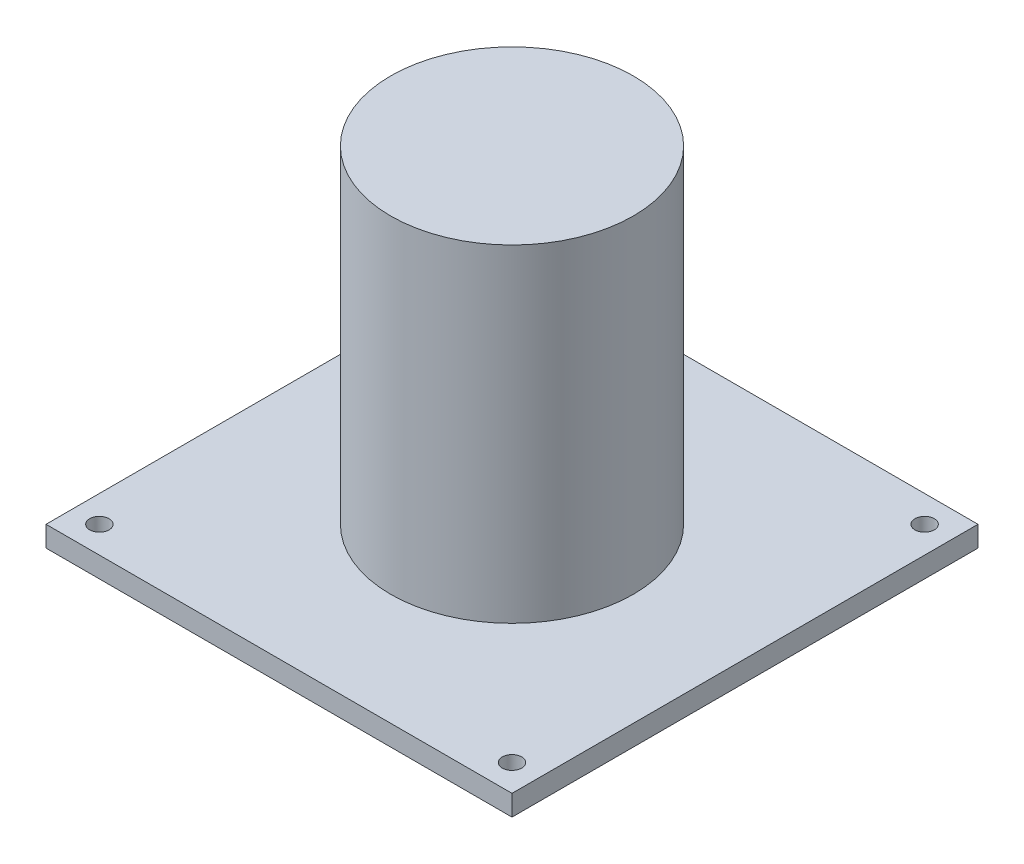
ISO-10303-21;
HEADER;
FILE_DESCRIPTION(('STEP AP214'),'2;1');
FILE_NAME('part.step','',(''),(''),'','','');
FILE_SCHEMA(('AUTOMOTIVE_DESIGN { 1 0 10303 214 1 1 1 1 }'));
ENDSEC;
DATA;
#1=APPLICATION_CONTEXT('core data for automotive mechanical design processes');
#2=APPLICATION_PROTOCOL_DEFINITION('international standard','automotive_design',2000,#1);
#3=PRODUCT_CONTEXT('',#1,'mechanical');
#4=PRODUCT('Part','Part','',(#3));
#5=PRODUCT_RELATED_PRODUCT_CATEGORY('part','',(#4));
#6=PRODUCT_DEFINITION_FORMATION('','',#4);
#7=PRODUCT_DEFINITION_CONTEXT('part definition',#1,'design');
#8=PRODUCT_DEFINITION('design','',#6,#7);
#9=PRODUCT_DEFINITION_SHAPE('','',#8);
#10=(LENGTH_UNIT() NAMED_UNIT(*) SI_UNIT(.MILLI.,.METRE.));
#11=(NAMED_UNIT(*) PLANE_ANGLE_UNIT() SI_UNIT($,.RADIAN.));
#12=(NAMED_UNIT(*) SI_UNIT($,.STERADIAN.) SOLID_ANGLE_UNIT());
#13=UNCERTAINTY_MEASURE_WITH_UNIT(LENGTH_MEASURE(1.E-05),#10,'distance_accuracy_value','');
#14=(GEOMETRIC_REPRESENTATION_CONTEXT(3) GLOBAL_UNCERTAINTY_ASSIGNED_CONTEXT((#13)) GLOBAL_UNIT_ASSIGNED_CONTEXT((#10,
#11,#12)) REPRESENTATION_CONTEXT('',''));
#15=CARTESIAN_POINT('',(0.,0.,0.));
#16=DIRECTION('',(0.,0.,1.));
#17=DIRECTION('',(1.,0.,0.));
#18=AXIS2_PLACEMENT_3D('',#15,#16,#17);
#19=CARTESIAN_POINT('',(19.2,1.7,19.2));
#20=DIRECTION('',(-1.,0.,0.));
#21=DIRECTION('',(0.,0.,1.));
#22=AXIS2_PLACEMENT_3D('',#19,#20,#21);
#23=PLANE('',#22);
#24=DIRECTION('',(0.,0.,-1.));
#25=VECTOR('',#24,1.);
#26=CARTESIAN_POINT('',(19.2,0.,19.2));
#27=LINE('',#26,#25);
#28=CARTESIAN_POINT('',(19.2,0.,19.2));
#29=VERTEX_POINT('',#28);
#30=CARTESIAN_POINT('',(19.2,0.,-19.2));
#31=VERTEX_POINT('',#30);
#32=EDGE_CURVE('E111',#29,#31,#27,.T.);
#33=ORIENTED_EDGE('',*,*,#32,.T.);
#34=DIRECTION('',(0.,-1.,0.));
#35=VECTOR('',#34,1.);
#36=CARTESIAN_POINT('',(19.2,1.7,-19.2));
#37=LINE('',#36,#35);
#38=CARTESIAN_POINT('',(19.2,1.7,-19.2));
#39=VERTEX_POINT('',#38);
#40=EDGE_CURVE('E43',#39,#31,#37,.T.);
#41=ORIENTED_EDGE('',*,*,#40,.F.);
#42=DIRECTION('',(0.,0.,-1.));
#43=VECTOR('',#42,1.);
#44=CARTESIAN_POINT('',(19.2,1.7,19.2));
#45=LINE('',#44,#43);
#46=CARTESIAN_POINT('',(19.2,1.7,19.2));
#47=VERTEX_POINT('',#46);
#48=EDGE_CURVE('E94',#47,#39,#45,.T.);
#49=ORIENTED_EDGE('',*,*,#48,.F.);
#50=DIRECTION('',(0.,-1.,0.));
#51=VECTOR('',#50,1.);
#52=CARTESIAN_POINT('',(19.2,1.7,19.2));
#53=LINE('',#52,#51);
#54=EDGE_CURVE('E107',#47,#29,#53,.T.);
#55=ORIENTED_EDGE('',*,*,#54,.T.);
#56=EDGE_LOOP('',(#33,#41,#49,#55));
#57=FACE_BOUND('',#56,.T.);
#58=ADVANCED_FACE('F40',(#57),#23,.F.);
#59=CARTESIAN_POINT('',(-19.2,1.7,-19.2));
#60=DIRECTION('',(0.,0.,1.));
#61=DIRECTION('',(1.,0.,0.));
#62=AXIS2_PLACEMENT_3D('',#59,#60,#61);
#63=PLANE('',#62);
#64=DIRECTION('',(-1.,0.,0.));
#65=VECTOR('',#64,1.);
#66=CARTESIAN_POINT('',(-19.2,0.,-19.2));
#67=LINE('',#66,#65);
#68=CARTESIAN_POINT('',(-19.2,0.,-19.2));
#69=VERTEX_POINT('',#68);
#70=EDGE_CURVE('E100',#31,#69,#67,.T.);
#71=ORIENTED_EDGE('',*,*,#70,.T.);
#72=DIRECTION('',(0.,-1.,0.));
#73=VECTOR('',#72,1.);
#74=CARTESIAN_POINT('',(-19.2,1.7,-19.2));
#75=LINE('',#74,#73);
#76=CARTESIAN_POINT('',(-19.2,1.7,-19.2));
#77=VERTEX_POINT('',#76);
#78=EDGE_CURVE('E98',#77,#69,#75,.T.);
#79=ORIENTED_EDGE('',*,*,#78,.F.);
#80=DIRECTION('',(-1.,0.,0.));
#81=VECTOR('',#80,1.);
#82=CARTESIAN_POINT('',(-19.2,1.7,-19.2));
#83=LINE('',#82,#81);
#84=EDGE_CURVE('E89',#39,#77,#83,.T.);
#85=ORIENTED_EDGE('',*,*,#84,.F.);
#86=ORIENTED_EDGE('',*,*,#40,.T.);
#87=EDGE_LOOP('',(#71,#79,#85,#86));
#88=FACE_BOUND('',#87,.T.);
#89=ADVANCED_FACE('F99',(#88),#63,.F.);
#90=CARTESIAN_POINT('',(-19.2,1.7,19.2));
#91=DIRECTION('',(1.,0.,0.));
#92=DIRECTION('',(0.,0.,-1.));
#93=AXIS2_PLACEMENT_3D('',#90,#91,#92);
#94=PLANE('',#93);
#95=DIRECTION('',(0.,0.,1.));
#96=VECTOR('',#95,1.);
#97=CARTESIAN_POINT('',(-19.2,0.,19.2));
#98=LINE('',#97,#96);
#99=CARTESIAN_POINT('',(-19.2,0.,19.2));
#100=VERTEX_POINT('',#99);
#101=EDGE_CURVE('E75',#69,#100,#98,.T.);
#102=ORIENTED_EDGE('',*,*,#101,.T.);
#103=DIRECTION('',(0.,-1.,0.));
#104=VECTOR('',#103,1.);
#105=CARTESIAN_POINT('',(-19.2,1.7,19.2));
#106=LINE('',#105,#104);
#107=CARTESIAN_POINT('',(-19.2,1.7,19.2));
#108=VERTEX_POINT('',#107);
#109=EDGE_CURVE('E102',#108,#100,#106,.T.);
#110=ORIENTED_EDGE('',*,*,#109,.F.);
#111=DIRECTION('',(0.,0.,1.));
#112=VECTOR('',#111,1.);
#113=CARTESIAN_POINT('',(-19.2,1.7,19.2));
#114=LINE('',#113,#112);
#115=EDGE_CURVE('E92',#77,#108,#114,.T.);
#116=ORIENTED_EDGE('',*,*,#115,.F.);
#117=ORIENTED_EDGE('',*,*,#78,.T.);
#118=EDGE_LOOP('',(#102,#110,#116,#117));
#119=FACE_BOUND('',#118,.T.);
#120=ADVANCED_FACE('F103',(#119),#94,.F.);
#121=CARTESIAN_POINT('',(-19.2,1.7,19.2));
#122=DIRECTION('',(0.,0.,-1.));
#123=DIRECTION('',(-1.,0.,0.));
#124=AXIS2_PLACEMENT_3D('',#121,#122,#123);
#125=PLANE('',#124);
#126=DIRECTION('',(1.,0.,0.));
#127=VECTOR('',#126,1.);
#128=CARTESIAN_POINT('',(-19.2,0.,19.2));
#129=LINE('',#128,#127);
#130=EDGE_CURVE('E81',#100,#29,#129,.T.);
#131=ORIENTED_EDGE('',*,*,#130,.T.);
#132=ORIENTED_EDGE('',*,*,#54,.F.);
#133=DIRECTION('',(1.,0.,0.));
#134=VECTOR('',#133,1.);
#135=CARTESIAN_POINT('',(-19.2,1.7,19.2));
#136=LINE('',#135,#134);
#137=EDGE_CURVE('E58',#108,#47,#136,.T.);
#138=ORIENTED_EDGE('',*,*,#137,.F.);
#139=ORIENTED_EDGE('',*,*,#109,.T.);
#140=EDGE_LOOP('',(#131,#132,#138,#139));
#141=FACE_BOUND('',#140,.T.);
#142=ADVANCED_FACE('F125',(#141),#125,.F.);
#143=CARTESIAN_POINT('',(0.,1.7,0.));
#144=DIRECTION('',(0.,-1.,0.));
#145=DIRECTION('',(0.,0.,-1.));
#146=AXIS2_PLACEMENT_3D('',#143,#144,#145);
#147=PLANE('',#146);
#148=CARTESIAN_POINT('',(-17.,1.7,-17.));
#149=DIRECTION('',(0.,-1.,0.));
#150=DIRECTION('',(0.,0.,-1.));
#151=AXIS2_PLACEMENT_3D('',#148,#149,#150);
#152=CIRCLE('',#151,0.799999999999999);
#153=CARTESIAN_POINT('',(-17.,1.7,-17.8));
#154=VERTEX_POINT('',#153);
#155=EDGE_CURVE('E135',#154,#154,#152,.T.);
#156=ORIENTED_EDGE('',*,*,#155,.T.);
#157=EDGE_LOOP('',(#156));
#158=FACE_BOUND('',#157,.T.);
#159=CARTESIAN_POINT('',(17.,1.7,-17.));
#160=DIRECTION('',(0.,-1.,0.));
#161=DIRECTION('',(0.,0.,-1.));
#162=AXIS2_PLACEMENT_3D('',#159,#160,#161);
#163=CIRCLE('',#162,0.799999999999999);
#164=CARTESIAN_POINT('',(17.,1.7,-17.8));
#165=VERTEX_POINT('',#164);
#166=EDGE_CURVE('E139',#165,#165,#163,.T.);
#167=ORIENTED_EDGE('',*,*,#166,.T.);
#168=EDGE_LOOP('',(#167));
#169=FACE_BOUND('',#168,.T.);
#170=CARTESIAN_POINT('',(17.,1.7,17.));
#171=DIRECTION('',(0.,-1.,0.));
#172=DIRECTION('',(0.,0.,-1.));
#173=AXIS2_PLACEMENT_3D('',#170,#171,#172);
#174=CIRCLE('',#173,0.799999999999999);
#175=CARTESIAN_POINT('',(17.,1.7,16.2));
#176=VERTEX_POINT('',#175);
#177=EDGE_CURVE('E143',#176,#176,#174,.T.);
#178=ORIENTED_EDGE('',*,*,#177,.T.);
#179=EDGE_LOOP('',(#178));
#180=FACE_BOUND('',#179,.T.);
#181=CARTESIAN_POINT('',(-17.,1.7,17.));
#182=DIRECTION('',(0.,-1.,0.));
#183=DIRECTION('',(0.,0.,-1.));
#184=AXIS2_PLACEMENT_3D('',#181,#182,#183);
#185=CIRCLE('',#184,0.799999999999999);
#186=CARTESIAN_POINT('',(-17.,1.7,16.2));
#187=VERTEX_POINT('',#186);
#188=EDGE_CURVE('E147',#187,#187,#185,.T.);
#189=ORIENTED_EDGE('',*,*,#188,.T.);
#190=EDGE_LOOP('',(#189));
#191=FACE_BOUND('',#190,.T.);
#192=CARTESIAN_POINT('',(0.,1.7,0.));
#193=DIRECTION('',(0.,1.,0.));
#194=DIRECTION('',(0.,0.,1.));
#195=AXIS2_PLACEMENT_3D('',#192,#193,#194);
#196=CIRCLE('',#195,10.);
#197=CARTESIAN_POINT('',(0.,1.7,10.));
#198=VERTEX_POINT('',#197);
#199=EDGE_CURVE('E11',#198,#198,#196,.T.);
#200=ORIENTED_EDGE('',*,*,#199,.F.);
#201=EDGE_LOOP('',(#200));
#202=FACE_BOUND('',#201,.T.);
#203=ORIENTED_EDGE('',*,*,#48,.T.);
#204=ORIENTED_EDGE('',*,*,#84,.T.);
#205=ORIENTED_EDGE('',*,*,#115,.T.);
#206=ORIENTED_EDGE('',*,*,#137,.T.);
#207=EDGE_LOOP('',(#203,#204,#205,#206));
#208=FACE_BOUND('',#207,.T.);
#209=ADVANCED_FACE('F90',(#158,#169,#180,#191,#202,#208),#147,.F.);
#210=CARTESIAN_POINT('',(0.,0.,0.));
#211=DIRECTION('',(0.,-1.,0.));
#212=DIRECTION('',(0.,0.,-1.));
#213=AXIS2_PLACEMENT_3D('',#210,#211,#212);
#214=PLANE('',#213);
#215=CARTESIAN_POINT('',(-17.,0.,-17.));
#216=DIRECTION('',(0.,-1.,0.));
#217=DIRECTION('',(0.,0.,-1.));
#218=AXIS2_PLACEMENT_3D('',#215,#216,#217);
#219=CIRCLE('',#218,0.799999999999999);
#220=CARTESIAN_POINT('',(-17.,0.,-17.8));
#221=VERTEX_POINT('',#220);
#222=EDGE_CURVE('E156',#221,#221,#219,.T.);
#223=ORIENTED_EDGE('',*,*,#222,.F.);
#224=EDGE_LOOP('',(#223));
#225=FACE_BOUND('',#224,.T.);
#226=CARTESIAN_POINT('',(17.,0.,-17.));
#227=DIRECTION('',(0.,-1.,0.));
#228=DIRECTION('',(0.,0.,-1.));
#229=AXIS2_PLACEMENT_3D('',#226,#227,#228);
#230=CIRCLE('',#229,0.799999999999999);
#231=CARTESIAN_POINT('',(17.,0.,-17.8));
#232=VERTEX_POINT('',#231);
#233=EDGE_CURVE('E160',#232,#232,#230,.T.);
#234=ORIENTED_EDGE('',*,*,#233,.F.);
#235=EDGE_LOOP('',(#234));
#236=FACE_BOUND('',#235,.T.);
#237=CARTESIAN_POINT('',(17.,0.,17.));
#238=DIRECTION('',(0.,-1.,0.));
#239=DIRECTION('',(0.,0.,-1.));
#240=AXIS2_PLACEMENT_3D('',#237,#238,#239);
#241=CIRCLE('',#240,0.799999999999999);
#242=CARTESIAN_POINT('',(17.,0.,16.2));
#243=VERTEX_POINT('',#242);
#244=EDGE_CURVE('E155',#243,#243,#241,.T.);
#245=ORIENTED_EDGE('',*,*,#244,.F.);
#246=EDGE_LOOP('',(#245));
#247=FACE_BOUND('',#246,.T.);
#248=CARTESIAN_POINT('',(-17.,0.,17.));
#249=DIRECTION('',(0.,-1.,0.));
#250=DIRECTION('',(0.,0.,-1.));
#251=AXIS2_PLACEMENT_3D('',#248,#249,#250);
#252=CIRCLE('',#251,0.799999999999999);
#253=CARTESIAN_POINT('',(-17.,0.,16.2));
#254=VERTEX_POINT('',#253);
#255=EDGE_CURVE('E151',#254,#254,#252,.T.);
#256=ORIENTED_EDGE('',*,*,#255,.F.);
#257=EDGE_LOOP('',(#256));
#258=FACE_BOUND('',#257,.T.);
#259=ORIENTED_EDGE('',*,*,#32,.F.);
#260=ORIENTED_EDGE('',*,*,#130,.F.);
#261=ORIENTED_EDGE('',*,*,#101,.F.);
#262=ORIENTED_EDGE('',*,*,#70,.F.);
#263=EDGE_LOOP('',(#259,#260,#261,#262));
#264=FACE_BOUND('',#263,.T.);
#265=ADVANCED_FACE('F128',(#225,#236,#247,#258,#264),#214,.T.);
#266=CARTESIAN_POINT('',(0.,28.7,0.));
#267=DIRECTION('',(0.,-1.,0.));
#268=DIRECTION('',(0.,0.,-1.));
#269=AXIS2_PLACEMENT_3D('',#266,#267,#268);
#270=CYLINDRICAL_SURFACE('',#269,10.);
#271=CARTESIAN_POINT('',(0.,28.7,0.));
#272=DIRECTION('',(0.,1.,0.));
#273=DIRECTION('',(0.,0.,1.));
#274=AXIS2_PLACEMENT_3D('',#271,#272,#273);
#275=CIRCLE('',#274,10.);
#276=CARTESIAN_POINT('',(0.,28.7,10.));
#277=VERTEX_POINT('',#276);
#278=EDGE_CURVE('E115',#277,#277,#275,.T.);
#279=ORIENTED_EDGE('',*,*,#278,.F.);
#280=EDGE_LOOP('',(#279));
#281=FACE_BOUND('',#280,.T.);
#282=ORIENTED_EDGE('',*,*,#199,.T.);
#283=EDGE_LOOP('',(#282));
#284=FACE_BOUND('',#283,.T.);
#285=ADVANCED_FACE('F173',(#281,#284),#270,.T.);
#286=CARTESIAN_POINT('',(0.,28.7,0.));
#287=DIRECTION('',(0.,1.,0.));
#288=DIRECTION('',(0.,0.,1.));
#289=AXIS2_PLACEMENT_3D('',#286,#287,#288);
#290=PLANE('',#289);
#291=ORIENTED_EDGE('',*,*,#278,.T.);
#292=EDGE_LOOP('',(#291));
#293=FACE_BOUND('',#292,.T.);
#294=ADVANCED_FACE('F181',(#293),#290,.T.);
#295=CARTESIAN_POINT('',(-17.,10.,17.));
#296=DIRECTION('',(0.,-1.,0.));
#297=DIRECTION('',(0.,0.,-1.));
#298=AXIS2_PLACEMENT_3D('',#295,#296,#297);
#299=CYLINDRICAL_SURFACE('',#298,0.799999999999999);
#300=ORIENTED_EDGE('',*,*,#255,.T.);
#301=EDGE_LOOP('',(#300));
#302=FACE_BOUND('',#301,.T.);
#303=ORIENTED_EDGE('',*,*,#188,.F.);
#304=EDGE_LOOP('',(#303));
#305=FACE_BOUND('',#304,.T.);
#306=ADVANCED_FACE('F178',(#302,#305),#299,.F.);
#307=CARTESIAN_POINT('',(17.,10.,17.));
#308=DIRECTION('',(0.,-1.,0.));
#309=DIRECTION('',(0.,0.,-1.));
#310=AXIS2_PLACEMENT_3D('',#307,#308,#309);
#311=CYLINDRICAL_SURFACE('',#310,0.799999999999999);
#312=ORIENTED_EDGE('',*,*,#244,.T.);
#313=EDGE_LOOP('',(#312));
#314=FACE_BOUND('',#313,.T.);
#315=ORIENTED_EDGE('',*,*,#177,.F.);
#316=EDGE_LOOP('',(#315));
#317=FACE_BOUND('',#316,.T.);
#318=ADVANCED_FACE('F168',(#314,#317),#311,.F.);
#319=CARTESIAN_POINT('',(17.,10.,-17.));
#320=DIRECTION('',(0.,-1.,0.));
#321=DIRECTION('',(0.,0.,-1.));
#322=AXIS2_PLACEMENT_3D('',#319,#320,#321);
#323=CYLINDRICAL_SURFACE('',#322,0.799999999999999);
#324=ORIENTED_EDGE('',*,*,#233,.T.);
#325=EDGE_LOOP('',(#324));
#326=FACE_BOUND('',#325,.T.);
#327=ORIENTED_EDGE('',*,*,#166,.F.);
#328=EDGE_LOOP('',(#327));
#329=FACE_BOUND('',#328,.T.);
#330=ADVANCED_FACE('F241',(#326,#329),#323,.F.);
#331=CARTESIAN_POINT('',(-17.,10.,-17.));
#332=DIRECTION('',(0.,-1.,0.));
#333=DIRECTION('',(0.,0.,-1.));
#334=AXIS2_PLACEMENT_3D('',#331,#332,#333);
#335=CYLINDRICAL_SURFACE('',#334,0.799999999999999);
#336=ORIENTED_EDGE('',*,*,#222,.T.);
#337=EDGE_LOOP('',(#336));
#338=FACE_BOUND('',#337,.T.);
#339=ORIENTED_EDGE('',*,*,#155,.F.);
#340=EDGE_LOOP('',(#339));
#341=FACE_BOUND('',#340,.T.);
#342=ADVANCED_FACE('F250',(#338,#341),#335,.F.);
#343=CLOSED_SHELL('',(#58,#89,#120,#142,#209,#265,#285,#294,#306,#318,#330,#342));
#344=MANIFOLD_SOLID_BREP('B2',#343);
#345=ADVANCED_BREP_SHAPE_REPRESENTATION('',(#18,#344),#14);
#346=SHAPE_DEFINITION_REPRESENTATION(#9,#345);
ENDSEC;
END-ISO-10303-21;
